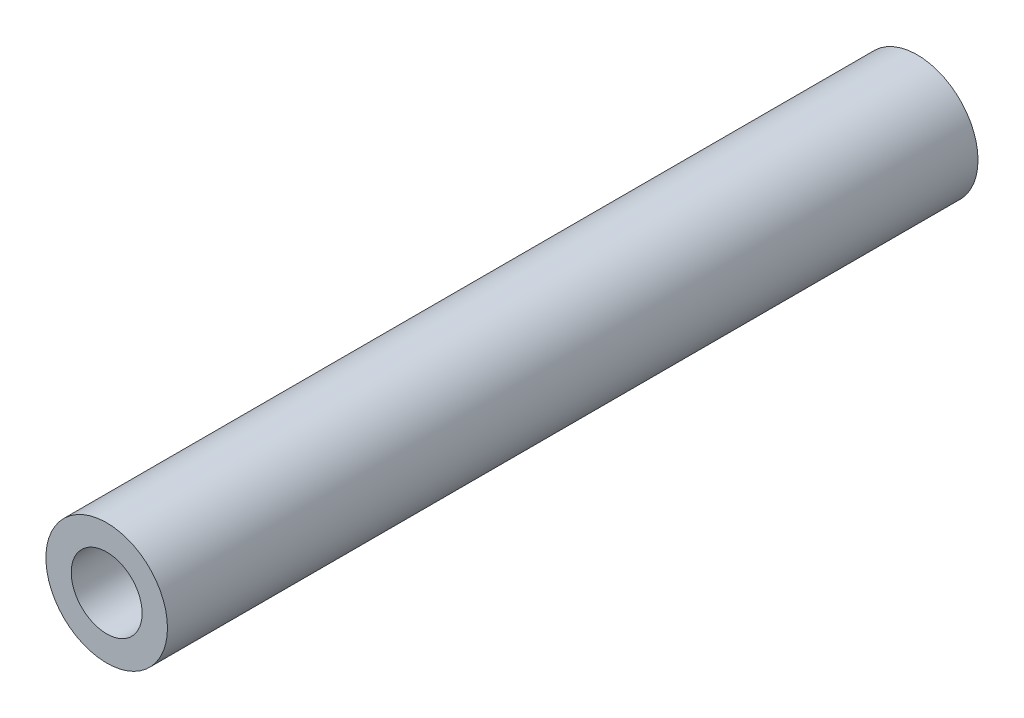
ISO-10303-21;
HEADER;
FILE_DESCRIPTION(('STEP AP214'),'2;1');
FILE_NAME('part.step','',(''),(''),'','','');
FILE_SCHEMA(('AUTOMOTIVE_DESIGN { 1 0 10303 214 1 1 1 1 }'));
ENDSEC;
DATA;
#1=APPLICATION_CONTEXT('core data for automotive mechanical design processes');
#2=APPLICATION_PROTOCOL_DEFINITION('international standard','automotive_design',2000,#1);
#3=PRODUCT_CONTEXT('',#1,'mechanical');
#4=PRODUCT('Part','Part','',(#3));
#5=PRODUCT_RELATED_PRODUCT_CATEGORY('part','',(#4));
#6=PRODUCT_DEFINITION_FORMATION('','',#4);
#7=PRODUCT_DEFINITION_CONTEXT('part definition',#1,'design');
#8=PRODUCT_DEFINITION('design','',#6,#7);
#9=PRODUCT_DEFINITION_SHAPE('','',#8);
#10=(LENGTH_UNIT() NAMED_UNIT(*) SI_UNIT(.MILLI.,.METRE.));
#11=(NAMED_UNIT(*) PLANE_ANGLE_UNIT() SI_UNIT($,.RADIAN.));
#12=(NAMED_UNIT(*) SI_UNIT($,.STERADIAN.) SOLID_ANGLE_UNIT());
#13=UNCERTAINTY_MEASURE_WITH_UNIT(LENGTH_MEASURE(1.E-05),#10,'distance_accuracy_value','');
#14=(GEOMETRIC_REPRESENTATION_CONTEXT(3) GLOBAL_UNCERTAINTY_ASSIGNED_CONTEXT((#13)) GLOBAL_UNIT_ASSIGNED_CONTEXT((#10,
#11,#12)) REPRESENTATION_CONTEXT('',''));
#15=CARTESIAN_POINT('',(0.,0.,0.));
#16=DIRECTION('',(0.,0.,1.));
#17=DIRECTION('',(1.,0.,0.));
#18=AXIS2_PLACEMENT_3D('',#15,#16,#17);
#19=CARTESIAN_POINT('',(0.,0.,40.));
#20=DIRECTION('',(0.,0.,1.));
#21=DIRECTION('',(1.,0.,0.));
#22=AXIS2_PLACEMENT_3D('',#19,#20,#21);
#23=PLANE('',#22);
#24=CARTESIAN_POINT('',(0.,0.,40.));
#25=DIRECTION('',(0.,0.,1.));
#26=DIRECTION('',(1.,0.,0.));
#27=AXIS2_PLACEMENT_3D('',#24,#25,#26);
#28=CIRCLE('',#27,3.);
#29=CARTESIAN_POINT('',(3.,0.,40.));
#30=VERTEX_POINT('',#29);
#31=EDGE_CURVE('E10',#30,#30,#28,.T.);
#32=ORIENTED_EDGE('',*,*,#31,.T.);
#33=EDGE_LOOP('',(#32));
#34=FACE_BOUND('',#33,.T.);
#35=CARTESIAN_POINT('',(0.,0.,40.));
#36=DIRECTION('',(0.,0.,1.));
#37=DIRECTION('',(1.,0.,0.));
#38=AXIS2_PLACEMENT_3D('',#35,#36,#37);
#39=CIRCLE('',#38,1.75);
#40=CARTESIAN_POINT('',(1.75,0.,40.));
#41=VERTEX_POINT('',#40);
#42=EDGE_CURVE('E44',#41,#41,#39,.T.);
#43=ORIENTED_EDGE('',*,*,#42,.F.);
#44=EDGE_LOOP('',(#43));
#45=FACE_BOUND('',#44,.T.);
#46=ADVANCED_FACE('F33',(#34,#45),#23,.T.);
#47=CARTESIAN_POINT('',(0.,0.,0.));
#48=DIRECTION('',(0.,0.,1.));
#49=DIRECTION('',(1.,0.,0.));
#50=AXIS2_PLACEMENT_3D('',#47,#48,#49);
#51=PLANE('',#50);
#52=CARTESIAN_POINT('',(0.,0.,0.));
#53=DIRECTION('',(0.,0.,1.));
#54=DIRECTION('',(1.,0.,0.));
#55=AXIS2_PLACEMENT_3D('',#52,#53,#54);
#56=CIRCLE('',#55,3.);
#57=CARTESIAN_POINT('',(3.,0.,0.));
#58=VERTEX_POINT('',#57);
#59=EDGE_CURVE('E37',#58,#58,#56,.T.);
#60=ORIENTED_EDGE('',*,*,#59,.F.);
#61=EDGE_LOOP('',(#60));
#62=FACE_BOUND('',#61,.T.);
#63=CARTESIAN_POINT('',(0.,0.,0.));
#64=DIRECTION('',(0.,0.,1.));
#65=DIRECTION('',(1.,0.,0.));
#66=AXIS2_PLACEMENT_3D('',#63,#64,#65);
#67=CIRCLE('',#66,1.75);
#68=CARTESIAN_POINT('',(1.75,0.,0.));
#69=VERTEX_POINT('',#68);
#70=EDGE_CURVE('E46',#69,#69,#67,.T.);
#71=ORIENTED_EDGE('',*,*,#70,.T.);
#72=EDGE_LOOP('',(#71));
#73=FACE_BOUND('',#72,.T.);
#74=ADVANCED_FACE('F56',(#62,#73),#51,.F.);
#75=CARTESIAN_POINT('',(0.,0.,40.));
#76=DIRECTION('',(0.,0.,-1.));
#77=DIRECTION('',(-1.,0.,0.));
#78=AXIS2_PLACEMENT_3D('',#75,#76,#77);
#79=CYLINDRICAL_SURFACE('',#78,3.);
#80=ORIENTED_EDGE('',*,*,#31,.F.);
#81=EDGE_LOOP('',(#80));
#82=FACE_BOUND('',#81,.T.);
#83=ORIENTED_EDGE('',*,*,#59,.T.);
#84=EDGE_LOOP('',(#83));
#85=FACE_BOUND('',#84,.T.);
#86=ADVANCED_FACE('F35',(#82,#85),#79,.T.);
#87=CARTESIAN_POINT('',(0.,0.,40.));
#88=DIRECTION('',(0.,0.,-1.));
#89=DIRECTION('',(-1.,0.,0.));
#90=AXIS2_PLACEMENT_3D('',#87,#88,#89);
#91=CYLINDRICAL_SURFACE('',#90,1.75);
#92=ORIENTED_EDGE('',*,*,#42,.T.);
#93=EDGE_LOOP('',(#92));
#94=FACE_BOUND('',#93,.T.);
#95=ORIENTED_EDGE('',*,*,#70,.F.);
#96=EDGE_LOOP('',(#95));
#97=FACE_BOUND('',#96,.T.);
#98=ADVANCED_FACE('F52',(#94,#97),#91,.F.);
#99=CLOSED_SHELL('',(#46,#74,#86,#98));
#100=MANIFOLD_SOLID_BREP('B2',#99);
#101=ADVANCED_BREP_SHAPE_REPRESENTATION('',(#18,#100),#14);
#102=SHAPE_DEFINITION_REPRESENTATION(#9,#101);
ENDSEC;
END-ISO-10303-21;
